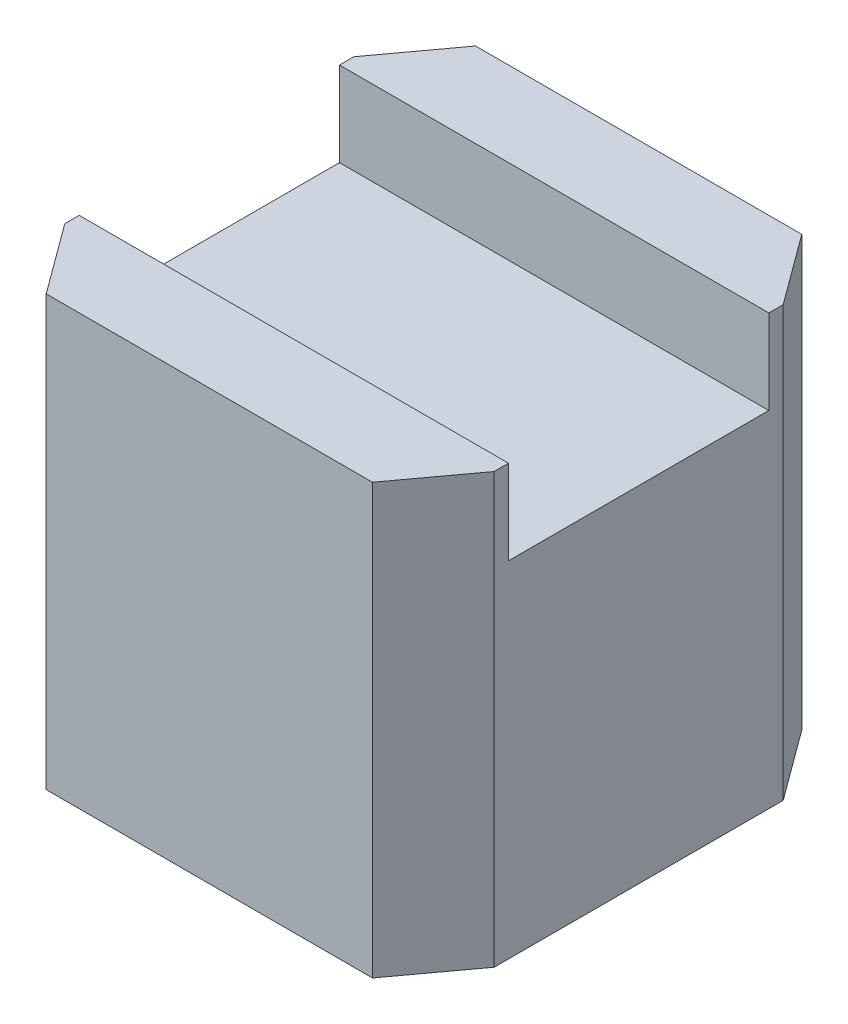
ISO-10303-21;
HEADER;
FILE_DESCRIPTION(('STEP AP214'),'2;1');
FILE_NAME('part.step','',(''),(''),'','','');
FILE_SCHEMA(('AUTOMOTIVE_DESIGN { 1 0 10303 214 1 1 1 1 }'));
ENDSEC;
DATA;
#1=APPLICATION_CONTEXT('core data for automotive mechanical design processes');
#2=APPLICATION_PROTOCOL_DEFINITION('international standard','automotive_design',2000,#1);
#3=PRODUCT_CONTEXT('',#1,'mechanical');
#4=PRODUCT('Part','Part','',(#3));
#5=PRODUCT_RELATED_PRODUCT_CATEGORY('part','',(#4));
#6=PRODUCT_DEFINITION_FORMATION('','',#4);
#7=PRODUCT_DEFINITION_CONTEXT('part definition',#1,'design');
#8=PRODUCT_DEFINITION('design','',#6,#7);
#9=PRODUCT_DEFINITION_SHAPE('','',#8);
#10=(LENGTH_UNIT() NAMED_UNIT(*) SI_UNIT(.MILLI.,.METRE.));
#11=(NAMED_UNIT(*) PLANE_ANGLE_UNIT() SI_UNIT($,.RADIAN.));
#12=(NAMED_UNIT(*) SI_UNIT($,.STERADIAN.) SOLID_ANGLE_UNIT());
#13=UNCERTAINTY_MEASURE_WITH_UNIT(LENGTH_MEASURE(1.E-05),#10,'distance_accuracy_value','');
#14=(GEOMETRIC_REPRESENTATION_CONTEXT(3) GLOBAL_UNCERTAINTY_ASSIGNED_CONTEXT((#13)) GLOBAL_UNIT_ASSIGNED_CONTEXT((#10,
#11,#12)) REPRESENTATION_CONTEXT('',''));
#15=CARTESIAN_POINT('',(0.,0.,0.));
#16=DIRECTION('',(0.,0.,1.));
#17=DIRECTION('',(1.,0.,0.));
#18=AXIS2_PLACEMENT_3D('',#15,#16,#17);
#19=CARTESIAN_POINT('',(0.,2.54,0.));
#20=DIRECTION('',(0.,-1.,0.));
#21=DIRECTION('',(0.,0.,-1.));
#22=AXIS2_PLACEMENT_3D('',#19,#20,#21);
#23=PLANE('',#22);
#24=DIRECTION('',(0.,0.,1.));
#25=VECTOR('',#24,1.);
#26=CARTESIAN_POINT('',(-1.27,2.54,-0.855));
#27=LINE('',#26,#25);
#28=CARTESIAN_POINT('',(-1.27,2.54,-0.855));
#29=VERTEX_POINT('',#28);
#30=CARTESIAN_POINT('',(-1.27,2.54,-0.77));
#31=VERTEX_POINT('',#30);
#32=EDGE_CURVE('E194',#29,#31,#27,.T.);
#33=ORIENTED_EDGE('',*,*,#32,.T.);
#34=DIRECTION('',(-1.,0.,0.));
#35=VECTOR('',#34,1.);
#36=CARTESIAN_POINT('',(-1.27,2.54,-0.77));
#37=LINE('',#36,#35);
#38=CARTESIAN_POINT('',(1.27,2.54,-0.77));
#39=VERTEX_POINT('',#38);
#40=EDGE_CURVE('E212',#39,#31,#37,.T.);
#41=ORIENTED_EDGE('',*,*,#40,.F.);
#42=DIRECTION('',(0.,0.,-1.));
#43=VECTOR('',#42,1.);
#44=CARTESIAN_POINT('',(1.27,2.54,-0.855));
#45=LINE('',#44,#43);
#46=CARTESIAN_POINT('',(1.27,2.54,-0.855));
#47=VERTEX_POINT('',#46);
#48=EDGE_CURVE('E59',#39,#47,#45,.T.);
#49=ORIENTED_EDGE('',*,*,#48,.T.);
#50=DIRECTION('',(-0.592205099861192,0.,-0.805787267024241));
#51=VECTOR('',#50,1.);
#52=CARTESIAN_POINT('',(0.964999999999999,2.54,-1.27));
#53=LINE('',#52,#51);
#54=CARTESIAN_POINT('',(0.964999999999999,2.54,-1.27));
#55=VERTEX_POINT('',#54);
#56=EDGE_CURVE('E165',#47,#55,#53,.T.);
#57=ORIENTED_EDGE('',*,*,#56,.T.);
#58=DIRECTION('',(-1.,0.,0.));
#59=VECTOR('',#58,1.);
#60=CARTESIAN_POINT('',(-0.965000000000001,2.54,-1.27));
#61=LINE('',#60,#59);
#62=CARTESIAN_POINT('',(-0.965000000000001,2.54,-1.27));
#63=VERTEX_POINT('',#62);
#64=EDGE_CURVE('E101',#55,#63,#61,.T.);
#65=ORIENTED_EDGE('',*,*,#64,.T.);
#66=DIRECTION('',(-0.592205099861189,0.,0.805787267024243));
#67=VECTOR('',#66,1.);
#68=CARTESIAN_POINT('',(-0.965000000000001,2.54,-1.27));
#69=LINE('',#68,#67);
#70=EDGE_CURVE('E180',#63,#29,#69,.T.);
#71=ORIENTED_EDGE('',*,*,#70,.T.);
#72=EDGE_LOOP('',(#33,#41,#49,#57,#65,#71));
#73=FACE_BOUND('',#72,.T.);
#74=ADVANCED_FACE('F35',(#73),#23,.F.);
#75=CARTESIAN_POINT('',(0.964999999999999,2.54,-1.27));
#76=DIRECTION('',(-0.805787267024241,0.,0.592205099861192));
#77=DIRECTION('',(0.592205099861192,0.,0.805787267024241));
#78=AXIS2_PLACEMENT_3D('',#75,#76,#77);
#79=PLANE('',#78);
#80=DIRECTION('',(-0.592205099861192,0.,-0.805787267024241));
#81=VECTOR('',#80,1.);
#82=CARTESIAN_POINT('',(0.964999999999999,0.,-1.27));
#83=LINE('',#82,#81);
#84=CARTESIAN_POINT('',(1.27,0.,-0.855));
#85=VERTEX_POINT('',#84);
#86=CARTESIAN_POINT('',(0.964999999999999,0.,-1.27));
#87=VERTEX_POINT('',#86);
#88=EDGE_CURVE('E149',#85,#87,#83,.T.);
#89=ORIENTED_EDGE('',*,*,#88,.T.);
#90=DIRECTION('',(0.,-1.,0.));
#91=VECTOR('',#90,1.);
#92=CARTESIAN_POINT('',(0.964999999999999,2.54,-1.27));
#93=LINE('',#92,#91);
#94=EDGE_CURVE('E11',#55,#87,#93,.T.);
#95=ORIENTED_EDGE('',*,*,#94,.F.);
#96=ORIENTED_EDGE('',*,*,#56,.F.);
#97=DIRECTION('',(0.,-1.,0.));
#98=VECTOR('',#97,1.);
#99=CARTESIAN_POINT('',(1.27,2.54,-0.855));
#100=LINE('',#99,#98);
#101=EDGE_CURVE('E148',#47,#85,#100,.T.);
#102=ORIENTED_EDGE('',*,*,#101,.T.);
#103=EDGE_LOOP('',(#89,#95,#96,#102));
#104=FACE_BOUND('',#103,.T.);
#105=ADVANCED_FACE('F37',(#104),#79,.F.);
#106=CARTESIAN_POINT('',(-0.965000000000001,2.54,-1.27));
#107=DIRECTION('',(0.,0.,1.));
#108=DIRECTION('',(1.,0.,0.));
#109=AXIS2_PLACEMENT_3D('',#106,#107,#108);
#110=PLANE('',#109);
#111=DIRECTION('',(-1.,0.,0.));
#112=VECTOR('',#111,1.);
#113=CARTESIAN_POINT('',(-0.965000000000001,0.,-1.27));
#114=LINE('',#113,#112);
#115=CARTESIAN_POINT('',(-0.965000000000001,0.,-1.27));
#116=VERTEX_POINT('',#115);
#117=EDGE_CURVE('E152',#87,#116,#114,.T.);
#118=ORIENTED_EDGE('',*,*,#117,.T.);
#119=DIRECTION('',(0.,-1.,0.));
#120=VECTOR('',#119,1.);
#121=CARTESIAN_POINT('',(-0.965000000000001,2.54,-1.27));
#122=LINE('',#121,#120);
#123=EDGE_CURVE('E43',#63,#116,#122,.T.);
#124=ORIENTED_EDGE('',*,*,#123,.F.);
#125=ORIENTED_EDGE('',*,*,#64,.F.);
#126=ORIENTED_EDGE('',*,*,#94,.T.);
#127=EDGE_LOOP('',(#118,#124,#125,#126));
#128=FACE_BOUND('',#127,.T.);
#129=ADVANCED_FACE('F251',(#128),#110,.F.);
#130=CARTESIAN_POINT('',(-0.965000000000001,2.54,-1.27));
#131=DIRECTION('',(0.805787267024243,0.,0.592205099861189));
#132=DIRECTION('',(0.592205099861189,0.,-0.805787267024243));
#133=AXIS2_PLACEMENT_3D('',#130,#131,#132);
#134=PLANE('',#133);
#135=DIRECTION('',(-0.592205099861189,0.,0.805787267024243));
#136=VECTOR('',#135,1.);
#137=CARTESIAN_POINT('',(-0.965000000000001,0.,-1.27));
#138=LINE('',#137,#136);
#139=CARTESIAN_POINT('',(-1.27,0.,-0.855));
#140=VERTEX_POINT('',#139);
#141=EDGE_CURVE('E155',#116,#140,#138,.T.);
#142=ORIENTED_EDGE('',*,*,#141,.T.);
#143=DIRECTION('',(0.,-1.,0.));
#144=VECTOR('',#143,1.);
#145=CARTESIAN_POINT('',(-1.27,2.54,-0.855));
#146=LINE('',#145,#144);
#147=EDGE_CURVE('E172',#29,#140,#146,.T.);
#148=ORIENTED_EDGE('',*,*,#147,.F.);
#149=ORIENTED_EDGE('',*,*,#70,.F.);
#150=ORIENTED_EDGE('',*,*,#123,.T.);
#151=EDGE_LOOP('',(#142,#148,#149,#150));
#152=FACE_BOUND('',#151,.T.);
#153=ADVANCED_FACE('F178',(#152),#134,.F.);
#154=CARTESIAN_POINT('',(-1.27,2.54,-0.855));
#155=DIRECTION('',(1.,0.,0.));
#156=DIRECTION('',(0.,0.,-1.));
#157=AXIS2_PLACEMENT_3D('',#154,#155,#156);
#158=PLANE('',#157);
#159=DIRECTION('',(0.,0.,1.));
#160=VECTOR('',#159,1.);
#161=CARTESIAN_POINT('',(-1.27,2.04,-0.77));
#162=LINE('',#161,#160);
#163=CARTESIAN_POINT('',(-1.27,2.04,-0.77));
#164=VERTEX_POINT('',#163);
#165=CARTESIAN_POINT('',(-1.27,2.04,0.77));
#166=VERTEX_POINT('',#165);
#167=EDGE_CURVE('E215',#164,#166,#162,.T.);
#168=ORIENTED_EDGE('',*,*,#167,.F.);
#169=DIRECTION('',(0.,1.,0.));
#170=VECTOR('',#169,1.);
#171=CARTESIAN_POINT('',(-1.27,2.04,-0.77));
#172=LINE('',#171,#170);
#173=EDGE_CURVE('E153',#164,#31,#172,.T.);
#174=ORIENTED_EDGE('',*,*,#173,.T.);
#175=ORIENTED_EDGE('',*,*,#32,.F.);
#176=ORIENTED_EDGE('',*,*,#147,.T.);
#177=DIRECTION('',(0.,0.,1.));
#178=VECTOR('',#177,1.);
#179=CARTESIAN_POINT('',(-1.27,0.,-0.855));
#180=LINE('',#179,#178);
#181=CARTESIAN_POINT('',(-1.27,0.,0.855));
#182=VERTEX_POINT('',#181);
#183=EDGE_CURVE('E157',#140,#182,#180,.T.);
#184=ORIENTED_EDGE('',*,*,#183,.T.);
#185=DIRECTION('',(0.,-1.,0.));
#186=VECTOR('',#185,1.);
#187=CARTESIAN_POINT('',(-1.27,2.54,0.855));
#188=LINE('',#187,#186);
#189=CARTESIAN_POINT('',(-1.27,2.54,0.855));
#190=VERTEX_POINT('',#189);
#191=EDGE_CURVE('E169',#190,#182,#188,.T.);
#192=ORIENTED_EDGE('',*,*,#191,.F.);
#193=CARTESIAN_POINT('',(-1.27,2.54,0.77));
#194=VERTEX_POINT('',#193);
#195=EDGE_CURVE('E196',#194,#190,#27,.T.);
#196=ORIENTED_EDGE('',*,*,#195,.F.);
#197=DIRECTION('',(0.,1.,0.));
#198=VECTOR('',#197,1.);
#199=CARTESIAN_POINT('',(-1.27,2.04,0.77));
#200=LINE('',#199,#198);
#201=EDGE_CURVE('E50',#166,#194,#200,.T.);
#202=ORIENTED_EDGE('',*,*,#201,.F.);
#203=EDGE_LOOP('',(#168,#174,#175,#176,#184,#192,#196,#202));
#204=FACE_BOUND('',#203,.T.);
#205=ADVANCED_FACE('F189',(#204),#158,.F.);
#206=CARTESIAN_POINT('',(-1.27,2.54,0.855));
#207=DIRECTION('',(0.805787267024244,0.,-0.592205099861188));
#208=DIRECTION('',(-0.592205099861189,0.,-0.805787267024244));
#209=AXIS2_PLACEMENT_3D('',#206,#207,#208);
#210=PLANE('',#209);
#211=DIRECTION('',(0.592205099861188,0.,0.805787267024244));
#212=VECTOR('',#211,1.);
#213=CARTESIAN_POINT('',(-1.27,0.,0.855));
#214=LINE('',#213,#212);
#215=CARTESIAN_POINT('',(-0.965000000000001,0.,1.27));
#216=VERTEX_POINT('',#215);
#217=EDGE_CURVE('E159',#182,#216,#214,.T.);
#218=ORIENTED_EDGE('',*,*,#217,.T.);
#219=DIRECTION('',(0.,-1.,0.));
#220=VECTOR('',#219,1.);
#221=CARTESIAN_POINT('',(-0.965000000000001,2.54,1.27));
#222=LINE('',#221,#220);
#223=CARTESIAN_POINT('',(-0.965000000000001,2.54,1.27));
#224=VERTEX_POINT('',#223);
#225=EDGE_CURVE('E138',#224,#216,#222,.T.);
#226=ORIENTED_EDGE('',*,*,#225,.F.);
#227=DIRECTION('',(0.592205099861188,0.,0.805787267024244));
#228=VECTOR('',#227,1.);
#229=CARTESIAN_POINT('',(-1.27,2.54,0.855));
#230=LINE('',#229,#228);
#231=EDGE_CURVE('E126',#190,#224,#230,.T.);
#232=ORIENTED_EDGE('',*,*,#231,.F.);
#233=ORIENTED_EDGE('',*,*,#191,.T.);
#234=EDGE_LOOP('',(#218,#226,#232,#233));
#235=FACE_BOUND('',#234,.T.);
#236=ADVANCED_FACE('F193',(#235),#210,.F.);
#237=CARTESIAN_POINT('',(-0.965000000000001,2.54,1.27));
#238=DIRECTION('',(0.,0.,-1.));
#239=DIRECTION('',(-1.,0.,0.));
#240=AXIS2_PLACEMENT_3D('',#237,#238,#239);
#241=PLANE('',#240);
#242=DIRECTION('',(1.,0.,0.));
#243=VECTOR('',#242,1.);
#244=CARTESIAN_POINT('',(-0.965000000000001,0.,1.27));
#245=LINE('',#244,#243);
#246=CARTESIAN_POINT('',(0.964999999999999,0.,1.27));
#247=VERTEX_POINT('',#246);
#248=EDGE_CURVE('E135',#216,#247,#245,.T.);
#249=ORIENTED_EDGE('',*,*,#248,.T.);
#250=DIRECTION('',(0.,-1.,0.));
#251=VECTOR('',#250,1.);
#252=CARTESIAN_POINT('',(0.964999999999999,2.54,1.27));
#253=LINE('',#252,#251);
#254=CARTESIAN_POINT('',(0.964999999999999,2.54,1.27));
#255=VERTEX_POINT('',#254);
#256=EDGE_CURVE('E132',#255,#247,#253,.T.);
#257=ORIENTED_EDGE('',*,*,#256,.F.);
#258=DIRECTION('',(1.,0.,0.));
#259=VECTOR('',#258,1.);
#260=CARTESIAN_POINT('',(-0.965000000000001,2.54,1.27));
#261=LINE('',#260,#259);
#262=EDGE_CURVE('E118',#224,#255,#261,.T.);
#263=ORIENTED_EDGE('',*,*,#262,.F.);
#264=ORIENTED_EDGE('',*,*,#225,.T.);
#265=EDGE_LOOP('',(#249,#257,#263,#264));
#266=FACE_BOUND('',#265,.T.);
#267=ADVANCED_FACE('F133',(#266),#241,.F.);
#268=CARTESIAN_POINT('',(1.27,2.54,0.855));
#269=DIRECTION('',(-0.805787267024241,0.,-0.592205099861192));
#270=DIRECTION('',(-0.592205099861192,0.,0.805787267024241));
#271=AXIS2_PLACEMENT_3D('',#268,#269,#270);
#272=PLANE('',#271);
#273=DIRECTION('',(0.592205099861192,0.,-0.805787267024241));
#274=VECTOR('',#273,1.);
#275=CARTESIAN_POINT('',(1.27,0.,0.855));
#276=LINE('',#275,#274);
#277=CARTESIAN_POINT('',(1.27,0.,0.855));
#278=VERTEX_POINT('',#277);
#279=EDGE_CURVE('E162',#247,#278,#276,.T.);
#280=ORIENTED_EDGE('',*,*,#279,.T.);
#281=DIRECTION('',(0.,-1.,0.));
#282=VECTOR('',#281,1.);
#283=CARTESIAN_POINT('',(1.27,2.54,0.855));
#284=LINE('',#283,#282);
#285=CARTESIAN_POINT('',(1.27,2.54,0.855));
#286=VERTEX_POINT('',#285);
#287=EDGE_CURVE('E139',#286,#278,#284,.T.);
#288=ORIENTED_EDGE('',*,*,#287,.F.);
#289=DIRECTION('',(0.592205099861192,0.,-0.805787267024241));
#290=VECTOR('',#289,1.);
#291=CARTESIAN_POINT('',(1.27,2.54,0.855));
#292=LINE('',#291,#290);
#293=EDGE_CURVE('E123',#255,#286,#292,.T.);
#294=ORIENTED_EDGE('',*,*,#293,.F.);
#295=ORIENTED_EDGE('',*,*,#256,.T.);
#296=EDGE_LOOP('',(#280,#288,#294,#295));
#297=FACE_BOUND('',#296,.T.);
#298=ADVANCED_FACE('F141',(#297),#272,.F.);
#299=CARTESIAN_POINT('',(1.27,2.54,-0.855));
#300=DIRECTION('',(-1.,0.,0.));
#301=DIRECTION('',(0.,0.,1.));
#302=AXIS2_PLACEMENT_3D('',#299,#300,#301);
#303=PLANE('',#302);
#304=ORIENTED_EDGE('',*,*,#48,.F.);
#305=DIRECTION('',(0.,1.,0.));
#306=VECTOR('',#305,1.);
#307=CARTESIAN_POINT('',(1.27,2.04,-0.77));
#308=LINE('',#307,#306);
#309=CARTESIAN_POINT('',(1.27,2.04,-0.77));
#310=VERTEX_POINT('',#309);
#311=EDGE_CURVE('E207',#310,#39,#308,.T.);
#312=ORIENTED_EDGE('',*,*,#311,.F.);
#313=DIRECTION('',(0.,0.,-1.));
#314=VECTOR('',#313,1.);
#315=CARTESIAN_POINT('',(1.27,2.04,-0.77));
#316=LINE('',#315,#314);
#317=CARTESIAN_POINT('',(1.27,2.04,0.77));
#318=VERTEX_POINT('',#317);
#319=EDGE_CURVE('E220',#318,#310,#316,.T.);
#320=ORIENTED_EDGE('',*,*,#319,.F.);
#321=DIRECTION('',(0.,1.,0.));
#322=VECTOR('',#321,1.);
#323=CARTESIAN_POINT('',(1.27,2.04,0.77));
#324=LINE('',#323,#322);
#325=CARTESIAN_POINT('',(1.27,2.54,0.77));
#326=VERTEX_POINT('',#325);
#327=EDGE_CURVE('E203',#318,#326,#324,.T.);
#328=ORIENTED_EDGE('',*,*,#327,.T.);
#329=EDGE_CURVE('E144',#286,#326,#45,.T.);
#330=ORIENTED_EDGE('',*,*,#329,.F.);
#331=ORIENTED_EDGE('',*,*,#287,.T.);
#332=DIRECTION('',(0.,0.,-1.));
#333=VECTOR('',#332,1.);
#334=CARTESIAN_POINT('',(1.27,0.,-0.855));
#335=LINE('',#334,#333);
#336=EDGE_CURVE('E93',#278,#85,#335,.T.);
#337=ORIENTED_EDGE('',*,*,#336,.T.);
#338=ORIENTED_EDGE('',*,*,#101,.F.);
#339=EDGE_LOOP('',(#304,#312,#320,#328,#330,#331,#337,#338));
#340=FACE_BOUND('',#339,.T.);
#341=ADVANCED_FACE('F239',(#340),#303,.F.);
#342=ORIENTED_EDGE('',*,*,#329,.T.);
#343=DIRECTION('',(1.,0.,0.));
#344=VECTOR('',#343,1.);
#345=CARTESIAN_POINT('',(-1.27,2.54,0.77));
#346=LINE('',#345,#344);
#347=EDGE_CURVE('E216',#194,#326,#346,.T.);
#348=ORIENTED_EDGE('',*,*,#347,.F.);
#349=ORIENTED_EDGE('',*,*,#195,.T.);
#350=ORIENTED_EDGE('',*,*,#231,.T.);
#351=ORIENTED_EDGE('',*,*,#262,.T.);
#352=ORIENTED_EDGE('',*,*,#293,.T.);
#353=EDGE_LOOP('',(#342,#348,#349,#350,#351,#352));
#354=FACE_BOUND('',#353,.T.);
#355=ADVANCED_FACE('F121',(#354),#23,.F.);
#356=CARTESIAN_POINT('',(0.,0.,0.));
#357=DIRECTION('',(0.,-1.,0.));
#358=DIRECTION('',(0.,0.,-1.));
#359=AXIS2_PLACEMENT_3D('',#356,#357,#358);
#360=PLANE('',#359);
#361=ORIENTED_EDGE('',*,*,#88,.F.);
#362=ORIENTED_EDGE('',*,*,#336,.F.);
#363=ORIENTED_EDGE('',*,*,#279,.F.);
#364=ORIENTED_EDGE('',*,*,#248,.F.);
#365=ORIENTED_EDGE('',*,*,#217,.F.);
#366=ORIENTED_EDGE('',*,*,#183,.F.);
#367=ORIENTED_EDGE('',*,*,#141,.F.);
#368=ORIENTED_EDGE('',*,*,#117,.F.);
#369=EDGE_LOOP('',(#361,#362,#363,#364,#365,#366,#367,#368));
#370=FACE_BOUND('',#369,.T.);
#371=ADVANCED_FACE('F184',(#370),#360,.T.);
#372=CARTESIAN_POINT('',(-1.27,2.04,-0.77));
#373=DIRECTION('',(0.,0.,-1.));
#374=DIRECTION('',(-1.,0.,0.));
#375=AXIS2_PLACEMENT_3D('',#372,#373,#374);
#376=PLANE('',#375);
#377=ORIENTED_EDGE('',*,*,#40,.T.);
#378=ORIENTED_EDGE('',*,*,#173,.F.);
#379=DIRECTION('',(-1.,0.,0.));
#380=VECTOR('',#379,1.);
#381=CARTESIAN_POINT('',(-1.27,2.04,-0.77));
#382=LINE('',#381,#380);
#383=EDGE_CURVE('E204',#310,#164,#382,.T.);
#384=ORIENTED_EDGE('',*,*,#383,.F.);
#385=ORIENTED_EDGE('',*,*,#311,.T.);
#386=EDGE_LOOP('',(#377,#378,#384,#385));
#387=FACE_BOUND('',#386,.T.);
#388=ADVANCED_FACE('F246',(#387),#376,.F.);
#389=CARTESIAN_POINT('',(-1.27,2.04,0.77));
#390=DIRECTION('',(0.,0.,1.));
#391=DIRECTION('',(1.,0.,0.));
#392=AXIS2_PLACEMENT_3D('',#389,#390,#391);
#393=PLANE('',#392);
#394=ORIENTED_EDGE('',*,*,#347,.T.);
#395=ORIENTED_EDGE('',*,*,#327,.F.);
#396=DIRECTION('',(1.,0.,0.));
#397=VECTOR('',#396,1.);
#398=CARTESIAN_POINT('',(-1.27,2.04,0.77));
#399=LINE('',#398,#397);
#400=EDGE_CURVE('E223',#166,#318,#399,.T.);
#401=ORIENTED_EDGE('',*,*,#400,.F.);
#402=ORIENTED_EDGE('',*,*,#201,.T.);
#403=EDGE_LOOP('',(#394,#395,#401,#402));
#404=FACE_BOUND('',#403,.T.);
#405=ADVANCED_FACE('F236',(#404),#393,.F.);
#406=CARTESIAN_POINT('',(0.,2.04,0.));
#407=DIRECTION('',(0.,1.,0.));
#408=DIRECTION('',(0.,0.,1.));
#409=AXIS2_PLACEMENT_3D('',#406,#407,#408);
#410=PLANE('',#409);
#411=ORIENTED_EDGE('',*,*,#167,.T.);
#412=ORIENTED_EDGE('',*,*,#400,.T.);
#413=ORIENTED_EDGE('',*,*,#319,.T.);
#414=ORIENTED_EDGE('',*,*,#383,.T.);
#415=EDGE_LOOP('',(#411,#412,#413,#414));
#416=FACE_BOUND('',#415,.T.);
#417=ADVANCED_FACE('F229',(#416),#410,.T.);
#418=CLOSED_SHELL('',(#74,#105,#129,#153,#205,#236,#267,#298,#341,#355,#371,#388,#405,#417));
#419=MANIFOLD_SOLID_BREP('B2',#418);
#420=ADVANCED_BREP_SHAPE_REPRESENTATION('',(#18,#419),#14);
#421=SHAPE_DEFINITION_REPRESENTATION(#9,#420);
ENDSEC;
END-ISO-10303-21;
